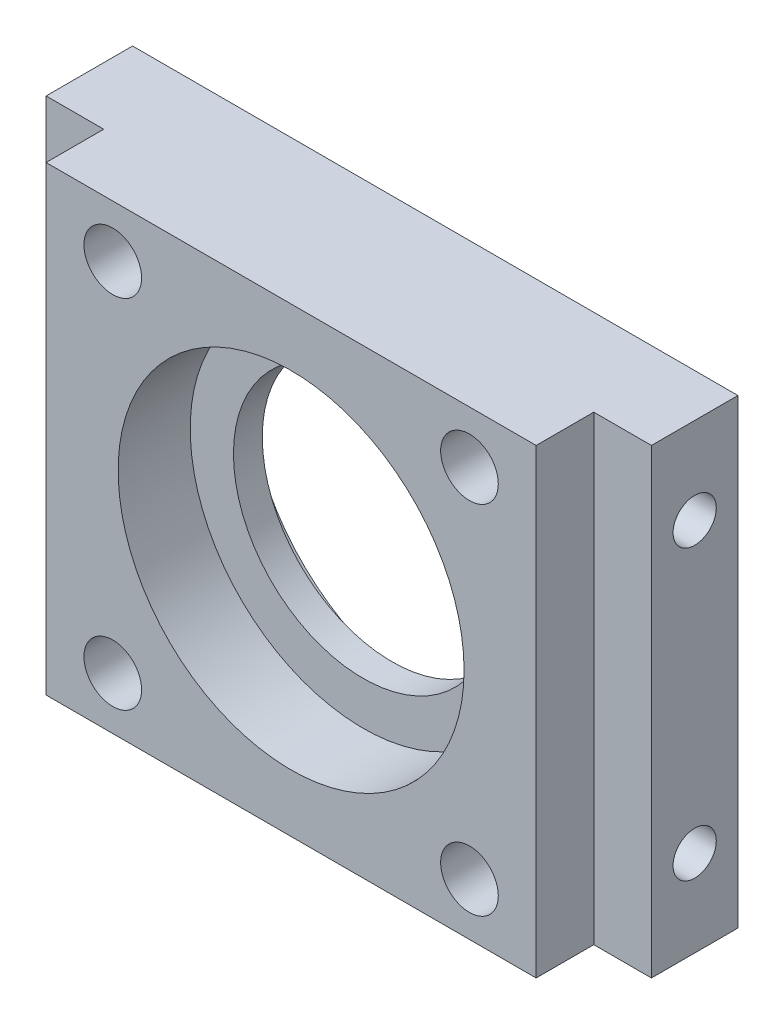
ISO-10303-21;
HEADER;
FILE_DESCRIPTION(('STEP AP214'),'2;1');
FILE_NAME('part.step','',(''),(''),'','','');
FILE_SCHEMA(('AUTOMOTIVE_DESIGN { 1 0 10303 214 1 1 1 1 }'));
ENDSEC;
DATA;
#1=APPLICATION_CONTEXT('core data for automotive mechanical design processes');
#2=APPLICATION_PROTOCOL_DEFINITION('international standard','automotive_design',2000,#1);
#3=PRODUCT_CONTEXT('',#1,'mechanical');
#4=PRODUCT('Part','Part','',(#3));
#5=PRODUCT_RELATED_PRODUCT_CATEGORY('part','',(#4));
#6=PRODUCT_DEFINITION_FORMATION('','',#4);
#7=PRODUCT_DEFINITION_CONTEXT('part definition',#1,'design');
#8=PRODUCT_DEFINITION('design','',#6,#7);
#9=PRODUCT_DEFINITION_SHAPE('','',#8);
#10=(LENGTH_UNIT() NAMED_UNIT(*) SI_UNIT(.MILLI.,.METRE.));
#11=(NAMED_UNIT(*) PLANE_ANGLE_UNIT() SI_UNIT($,.RADIAN.));
#12=(NAMED_UNIT(*) SI_UNIT($,.STERADIAN.) SOLID_ANGLE_UNIT());
#13=UNCERTAINTY_MEASURE_WITH_UNIT(LENGTH_MEASURE(1.E-05),#10,'distance_accuracy_value','');
#14=(GEOMETRIC_REPRESENTATION_CONTEXT(3) GLOBAL_UNCERTAINTY_ASSIGNED_CONTEXT((#13)) GLOBAL_UNIT_ASSIGNED_CONTEXT((#10,
#11,#12)) REPRESENTATION_CONTEXT('',''));
#15=CARTESIAN_POINT('',(0.,0.,0.));
#16=DIRECTION('',(0.,0.,1.));
#17=DIRECTION('',(1.,0.,0.));
#18=AXIS2_PLACEMENT_3D('',#15,#16,#17);
#19=CARTESIAN_POINT('',(0.,0.,38.5269119345812));
#20=DIRECTION('',(0.,0.,-1.));
#21=DIRECTION('',(-1.,0.,0.));
#22=AXIS2_PLACEMENT_3D('',#19,#20,#21);
#23=CYLINDRICAL_SURFACE('',#22,9.);
#24=CARTESIAN_POINT('',(0.,0.,5.));
#25=DIRECTION('',(0.,0.,1.));
#26=DIRECTION('',(1.,0.,0.));
#27=AXIS2_PLACEMENT_3D('',#24,#25,#26);
#28=CIRCLE('',#27,9.);
#29=CARTESIAN_POINT('',(9.,0.,5.));
#30=VERTEX_POINT('',#29);
#31=EDGE_CURVE('E176',#30,#30,#28,.F.);
#32=ORIENTED_EDGE('',*,*,#31,.F.);
#33=EDGE_LOOP('',(#32));
#34=FACE_BOUND('',#33,.T.);
#35=CARTESIAN_POINT('',(0.,0.,3.));
#36=DIRECTION('',(0.,0.,-1.));
#37=DIRECTION('',(-1.,0.,0.));
#38=AXIS2_PLACEMENT_3D('',#35,#36,#37);
#39=CIRCLE('',#38,9.);
#40=CARTESIAN_POINT('',(-9.,0.,3.));
#41=VERTEX_POINT('',#40);
#42=EDGE_CURVE('E46',#41,#41,#39,.F.);
#43=ORIENTED_EDGE('',*,*,#42,.F.);
#44=EDGE_LOOP('',(#43));
#45=FACE_BOUND('',#44,.T.);
#46=ADVANCED_FACE('F42',(#34,#45),#23,.F.);
#47=CARTESIAN_POINT('',(21.,-16.,0.));
#48=DIRECTION('',(1.,0.,0.));
#49=DIRECTION('',(0.,1.,0.));
#50=AXIS2_PLACEMENT_3D('',#47,#48,#49);
#51=PLANE('',#50);
#52=CARTESIAN_POINT('',(21.,-9.99999999999999,3.));
#53=DIRECTION('',(1.,0.,0.));
#54=DIRECTION('',(0.,0.,-1.));
#55=AXIS2_PLACEMENT_3D('',#52,#53,#54);
#56=CIRCLE('',#55,1.49999999999999);
#57=CARTESIAN_POINT('',(21.,-9.99999999999999,1.50000000000001));
#58=VERTEX_POINT('',#57);
#59=EDGE_CURVE('E206',#58,#58,#56,.T.);
#60=ORIENTED_EDGE('',*,*,#59,.F.);
#61=EDGE_LOOP('',(#60));
#62=FACE_BOUND('',#61,.T.);
#63=CARTESIAN_POINT('',(21.,10.,3.));
#64=DIRECTION('',(1.,0.,0.));
#65=DIRECTION('',(0.,0.,-1.));
#66=AXIS2_PLACEMENT_3D('',#63,#64,#65);
#67=CIRCLE('',#66,1.49999999999999);
#68=CARTESIAN_POINT('',(21.,10.,1.50000000000001));
#69=VERTEX_POINT('',#68);
#70=EDGE_CURVE('E212',#69,#69,#67,.T.);
#71=ORIENTED_EDGE('',*,*,#70,.F.);
#72=EDGE_LOOP('',(#71));
#73=FACE_BOUND('',#72,.T.);
#74=DIRECTION('',(0.,-1.,0.));
#75=VECTOR('',#74,1.);
#76=CARTESIAN_POINT('',(21.,16.,6.));
#77=LINE('',#76,#75);
#78=CARTESIAN_POINT('',(21.,16.,6.));
#79=VERTEX_POINT('',#78);
#80=CARTESIAN_POINT('',(21.,-16.,6.));
#81=VERTEX_POINT('',#80);
#82=EDGE_CURVE('E115',#79,#81,#77,.T.);
#83=ORIENTED_EDGE('',*,*,#82,.T.);
#84=DIRECTION('',(0.,0.,1.));
#85=VECTOR('',#84,1.);
#86=CARTESIAN_POINT('',(21.,-16.,0.));
#87=LINE('',#86,#85);
#88=CARTESIAN_POINT('',(21.,-16.,0.));
#89=VERTEX_POINT('',#88);
#90=EDGE_CURVE('E11',#89,#81,#87,.T.);
#91=ORIENTED_EDGE('',*,*,#90,.F.);
#92=DIRECTION('',(0.,1.,0.));
#93=VECTOR('',#92,1.);
#94=CARTESIAN_POINT('',(21.,-16.,0.));
#95=LINE('',#94,#93);
#96=CARTESIAN_POINT('',(21.,16.,0.));
#97=VERTEX_POINT('',#96);
#98=EDGE_CURVE('E154',#89,#97,#95,.T.);
#99=ORIENTED_EDGE('',*,*,#98,.T.);
#100=DIRECTION('',(0.,0.,1.));
#101=VECTOR('',#100,1.);
#102=CARTESIAN_POINT('',(21.,16.,0.));
#103=LINE('',#102,#101);
#104=EDGE_CURVE('E167',#97,#79,#103,.T.);
#105=ORIENTED_EDGE('',*,*,#104,.T.);
#106=EDGE_LOOP('',(#83,#91,#99,#105));
#107=FACE_BOUND('',#106,.T.);
#108=ADVANCED_FACE('F44',(#62,#73,#107),#51,.T.);
#109=CARTESIAN_POINT('',(-21.,-16.,0.));
#110=DIRECTION('',(0.,-1.,0.));
#111=DIRECTION('',(0.,0.,-1.));
#112=AXIS2_PLACEMENT_3D('',#109,#110,#111);
#113=PLANE('',#112);
#114=DIRECTION('',(1.,0.,0.));
#115=VECTOR('',#114,1.);
#116=CARTESIAN_POINT('',(17.,-16.,6.));
#117=LINE('',#116,#115);
#118=CARTESIAN_POINT('',(17.,-16.,6.));
#119=VERTEX_POINT('',#118);
#120=EDGE_CURVE('E129',#119,#81,#117,.T.);
#121=ORIENTED_EDGE('',*,*,#120,.F.);
#122=DIRECTION('',(0.,0.,-1.));
#123=VECTOR('',#122,1.);
#124=CARTESIAN_POINT('',(17.,-16.,10.));
#125=LINE('',#124,#123);
#126=CARTESIAN_POINT('',(17.,-16.,10.));
#127=VERTEX_POINT('',#126);
#128=EDGE_CURVE('E112',#127,#119,#125,.T.);
#129=ORIENTED_EDGE('',*,*,#128,.F.);
#130=DIRECTION('',(1.,0.,0.));
#131=VECTOR('',#130,1.);
#132=CARTESIAN_POINT('',(-21.,-16.,10.));
#133=LINE('',#132,#131);
#134=CARTESIAN_POINT('',(-17.,-16.,10.));
#135=VERTEX_POINT('',#134);
#136=EDGE_CURVE('E158',#135,#127,#133,.T.);
#137=ORIENTED_EDGE('',*,*,#136,.F.);
#138=DIRECTION('',(0.,0.,1.));
#139=VECTOR('',#138,1.);
#140=CARTESIAN_POINT('',(-17.,-16.,6.));
#141=LINE('',#140,#139);
#142=CARTESIAN_POINT('',(-17.,-16.,6.));
#143=VERTEX_POINT('',#142);
#144=EDGE_CURVE('E67',#143,#135,#141,.T.);
#145=ORIENTED_EDGE('',*,*,#144,.F.);
#146=DIRECTION('',(1.,0.,0.));
#147=VECTOR('',#146,1.);
#148=CARTESIAN_POINT('',(-21.,-16.,6.));
#149=LINE('',#148,#147);
#150=CARTESIAN_POINT('',(-21.,-16.,6.));
#151=VERTEX_POINT('',#150);
#152=EDGE_CURVE('E137',#151,#143,#149,.T.);
#153=ORIENTED_EDGE('',*,*,#152,.F.);
#154=DIRECTION('',(0.,0.,1.));
#155=VECTOR('',#154,1.);
#156=CARTESIAN_POINT('',(-21.,-16.,0.));
#157=LINE('',#156,#155);
#158=CARTESIAN_POINT('',(-21.,-16.,0.));
#159=VERTEX_POINT('',#158);
#160=EDGE_CURVE('E51',#159,#151,#157,.T.);
#161=ORIENTED_EDGE('',*,*,#160,.F.);
#162=DIRECTION('',(1.,0.,0.));
#163=VECTOR('',#162,1.);
#164=CARTESIAN_POINT('',(-21.,-16.,0.));
#165=LINE('',#164,#163);
#166=EDGE_CURVE('E164',#159,#89,#165,.T.);
#167=ORIENTED_EDGE('',*,*,#166,.T.);
#168=ORIENTED_EDGE('',*,*,#90,.T.);
#169=EDGE_LOOP('',(#121,#129,#137,#145,#153,#161,#167,#168));
#170=FACE_BOUND('',#169,.T.);
#171=ADVANCED_FACE('F264',(#170),#113,.T.);
#172=CARTESIAN_POINT('',(-21.,16.,0.));
#173=DIRECTION('',(-1.,0.,0.));
#174=DIRECTION('',(0.,-1.,0.));
#175=AXIS2_PLACEMENT_3D('',#172,#173,#174);
#176=PLANE('',#175);
#177=CARTESIAN_POINT('',(-21.,-9.99999999999999,3.));
#178=DIRECTION('',(-1.,0.,0.));
#179=DIRECTION('',(0.,0.,1.));
#180=AXIS2_PLACEMENT_3D('',#177,#178,#179);
#181=CIRCLE('',#180,1.49999999999999);
#182=CARTESIAN_POINT('',(-21.,-9.99999999999999,4.49999999999999));
#183=VERTEX_POINT('',#182);
#184=EDGE_CURVE('E183',#183,#183,#181,.T.);
#185=ORIENTED_EDGE('',*,*,#184,.F.);
#186=EDGE_LOOP('',(#185));
#187=FACE_BOUND('',#186,.T.);
#188=CARTESIAN_POINT('',(-21.,10.,3.));
#189=DIRECTION('',(-1.,0.,0.));
#190=DIRECTION('',(0.,0.,1.));
#191=AXIS2_PLACEMENT_3D('',#188,#189,#190);
#192=CIRCLE('',#191,1.49999999999999);
#193=CARTESIAN_POINT('',(-21.,10.,4.49999999999999));
#194=VERTEX_POINT('',#193);
#195=EDGE_CURVE('E200',#194,#194,#192,.T.);
#196=ORIENTED_EDGE('',*,*,#195,.F.);
#197=EDGE_LOOP('',(#196));
#198=FACE_BOUND('',#197,.T.);
#199=DIRECTION('',(0.,-1.,0.));
#200=VECTOR('',#199,1.);
#201=CARTESIAN_POINT('',(-21.,16.,6.));
#202=LINE('',#201,#200);
#203=CARTESIAN_POINT('',(-21.,16.,6.));
#204=VERTEX_POINT('',#203);
#205=EDGE_CURVE('E145',#204,#151,#202,.T.);
#206=ORIENTED_EDGE('',*,*,#205,.F.);
#207=DIRECTION('',(0.,0.,1.));
#208=VECTOR('',#207,1.);
#209=CARTESIAN_POINT('',(-21.,16.,0.));
#210=LINE('',#209,#208);
#211=CARTESIAN_POINT('',(-21.,16.,0.));
#212=VERTEX_POINT('',#211);
#213=EDGE_CURVE('E173',#212,#204,#210,.T.);
#214=ORIENTED_EDGE('',*,*,#213,.F.);
#215=DIRECTION('',(0.,-1.,0.));
#216=VECTOR('',#215,1.);
#217=CARTESIAN_POINT('',(-21.,16.,0.));
#218=LINE('',#217,#216);
#219=EDGE_CURVE('E161',#212,#159,#218,.T.);
#220=ORIENTED_EDGE('',*,*,#219,.T.);
#221=ORIENTED_EDGE('',*,*,#160,.T.);
#222=EDGE_LOOP('',(#206,#214,#220,#221));
#223=FACE_BOUND('',#222,.T.);
#224=ADVANCED_FACE('F337',(#187,#198,#223),#176,.T.);
#225=CARTESIAN_POINT('',(21.,16.,0.));
#226=DIRECTION('',(0.,1.,0.));
#227=DIRECTION('',(0.,0.,1.));
#228=AXIS2_PLACEMENT_3D('',#225,#226,#227);
#229=PLANE('',#228);
#230=DIRECTION('',(1.,0.,0.));
#231=VECTOR('',#230,1.);
#232=CARTESIAN_POINT('',(17.,16.,6.));
#233=LINE('',#232,#231);
#234=CARTESIAN_POINT('',(17.,16.,6.));
#235=VERTEX_POINT('',#234);
#236=EDGE_CURVE('E119',#235,#79,#233,.T.);
#237=ORIENTED_EDGE('',*,*,#236,.T.);
#238=ORIENTED_EDGE('',*,*,#104,.F.);
#239=DIRECTION('',(-1.,0.,0.));
#240=VECTOR('',#239,1.);
#241=CARTESIAN_POINT('',(21.,16.,0.));
#242=LINE('',#241,#240);
#243=EDGE_CURVE('E157',#97,#212,#242,.T.);
#244=ORIENTED_EDGE('',*,*,#243,.T.);
#245=ORIENTED_EDGE('',*,*,#213,.T.);
#246=DIRECTION('',(1.,0.,0.));
#247=VECTOR('',#246,1.);
#248=CARTESIAN_POINT('',(-21.,16.,6.));
#249=LINE('',#248,#247);
#250=CARTESIAN_POINT('',(-17.,16.,6.));
#251=VERTEX_POINT('',#250);
#252=EDGE_CURVE('E140',#204,#251,#249,.T.);
#253=ORIENTED_EDGE('',*,*,#252,.T.);
#254=DIRECTION('',(0.,0.,1.));
#255=VECTOR('',#254,1.);
#256=CARTESIAN_POINT('',(-17.,16.,6.));
#257=LINE('',#256,#255);
#258=CARTESIAN_POINT('',(-17.,16.,10.));
#259=VERTEX_POINT('',#258);
#260=EDGE_CURVE('E143',#251,#259,#257,.T.);
#261=ORIENTED_EDGE('',*,*,#260,.T.);
#262=DIRECTION('',(-1.,0.,0.));
#263=VECTOR('',#262,1.);
#264=CARTESIAN_POINT('',(21.,16.,10.));
#265=LINE('',#264,#263);
#266=CARTESIAN_POINT('',(17.,16.,10.));
#267=VERTEX_POINT('',#266);
#268=EDGE_CURVE('E128',#267,#259,#265,.T.);
#269=ORIENTED_EDGE('',*,*,#268,.F.);
#270=DIRECTION('',(0.,0.,-1.));
#271=VECTOR('',#270,1.);
#272=CARTESIAN_POINT('',(17.,16.,10.));
#273=LINE('',#272,#271);
#274=EDGE_CURVE('E59',#267,#235,#273,.T.);
#275=ORIENTED_EDGE('',*,*,#274,.T.);
#276=EDGE_LOOP('',(#237,#238,#244,#245,#253,#261,#269,#275));
#277=FACE_BOUND('',#276,.T.);
#278=ADVANCED_FACE('F126',(#277),#229,.T.);
#279=CARTESIAN_POINT('',(0.,0.,0.));
#280=DIRECTION('',(0.,0.,1.));
#281=DIRECTION('',(1.,0.,0.));
#282=AXIS2_PLACEMENT_3D('',#279,#280,#281);
#283=PLANE('',#282);
#284=CARTESIAN_POINT('',(0.,0.,0.));
#285=DIRECTION('',(0.,0.,-1.));
#286=DIRECTION('',(-1.,0.,0.));
#287=AXIS2_PLACEMENT_3D('',#284,#285,#286);
#288=CIRCLE('',#287,13.);
#289=CARTESIAN_POINT('',(-13.,0.,0.));
#290=VERTEX_POINT('',#289);
#291=EDGE_CURVE('E192',#290,#290,#288,.T.);
#292=ORIENTED_EDGE('',*,*,#291,.F.);
#293=EDGE_LOOP('',(#292));
#294=FACE_BOUND('',#293,.T.);
#295=CARTESIAN_POINT('',(12.3743686707646,12.3743686707646,0.));
#296=DIRECTION('',(0.,0.,1.));
#297=DIRECTION('',(1.,0.,0.));
#298=AXIS2_PLACEMENT_3D('',#295,#296,#297);
#299=CIRCLE('',#298,1.99999999999999);
#300=CARTESIAN_POINT('',(14.3743686707646,12.3743686707646,0.));
#301=VERTEX_POINT('',#300);
#302=EDGE_CURVE('E221',#301,#301,#299,.T.);
#303=ORIENTED_EDGE('',*,*,#302,.T.);
#304=EDGE_LOOP('',(#303));
#305=FACE_BOUND('',#304,.T.);
#306=CARTESIAN_POINT('',(12.3743686707646,-12.3743686707646,0.));
#307=DIRECTION('',(0.,0.,1.));
#308=DIRECTION('',(1.,0.,0.));
#309=AXIS2_PLACEMENT_3D('',#306,#307,#308);
#310=CIRCLE('',#309,1.99999999999999);
#311=CARTESIAN_POINT('',(14.3743686707646,-12.3743686707646,0.));
#312=VERTEX_POINT('',#311);
#313=EDGE_CURVE('E227',#312,#312,#310,.T.);
#314=ORIENTED_EDGE('',*,*,#313,.T.);
#315=EDGE_LOOP('',(#314));
#316=FACE_BOUND('',#315,.T.);
#317=CARTESIAN_POINT('',(-12.3743686707646,-12.3743686707646,0.));
#318=DIRECTION('',(0.,0.,1.));
#319=DIRECTION('',(1.,0.,0.));
#320=AXIS2_PLACEMENT_3D('',#317,#318,#319);
#321=CIRCLE('',#320,1.99999999999999);
#322=CARTESIAN_POINT('',(-10.3743686707646,-12.3743686707646,0.));
#323=VERTEX_POINT('',#322);
#324=EDGE_CURVE('E233',#323,#323,#321,.T.);
#325=ORIENTED_EDGE('',*,*,#324,.T.);
#326=EDGE_LOOP('',(#325));
#327=FACE_BOUND('',#326,.T.);
#328=CARTESIAN_POINT('',(-12.3743686707646,12.3743686707646,0.));
#329=DIRECTION('',(0.,0.,1.));
#330=DIRECTION('',(1.,0.,0.));
#331=AXIS2_PLACEMENT_3D('',#328,#329,#330);
#332=CIRCLE('',#331,1.99999999999999);
#333=CARTESIAN_POINT('',(-10.3743686707646,12.3743686707646,0.));
#334=VERTEX_POINT('',#333);
#335=EDGE_CURVE('E133',#334,#334,#332,.T.);
#336=ORIENTED_EDGE('',*,*,#335,.T.);
#337=EDGE_LOOP('',(#336));
#338=FACE_BOUND('',#337,.T.);
#339=ORIENTED_EDGE('',*,*,#98,.F.);
#340=ORIENTED_EDGE('',*,*,#166,.F.);
#341=ORIENTED_EDGE('',*,*,#219,.F.);
#342=ORIENTED_EDGE('',*,*,#243,.F.);
#343=EDGE_LOOP('',(#339,#340,#341,#342));
#344=FACE_BOUND('',#343,.T.);
#345=ADVANCED_FACE('F242',(#294,#305,#316,#327,#338,#344),#283,.F.);
#346=CARTESIAN_POINT('',(0.,0.,10.));
#347=DIRECTION('',(0.,0.,1.));
#348=DIRECTION('',(1.,0.,0.));
#349=AXIS2_PLACEMENT_3D('',#346,#347,#348);
#350=PLANE('',#349);
#351=CARTESIAN_POINT('',(0.,0.,10.));
#352=DIRECTION('',(0.,0.,1.));
#353=DIRECTION('',(1.,0.,0.));
#354=AXIS2_PLACEMENT_3D('',#351,#352,#353);
#355=CIRCLE('',#354,12.);
#356=CARTESIAN_POINT('',(12.,0.,10.));
#357=VERTEX_POINT('',#356);
#358=EDGE_CURVE('E178',#357,#357,#355,.T.);
#359=ORIENTED_EDGE('',*,*,#358,.F.);
#360=EDGE_LOOP('',(#359));
#361=FACE_BOUND('',#360,.T.);
#362=CARTESIAN_POINT('',(12.3743686707646,12.3743686707646,10.));
#363=DIRECTION('',(0.,0.,1.));
#364=DIRECTION('',(1.,0.,0.));
#365=AXIS2_PLACEMENT_3D('',#362,#363,#364);
#366=CIRCLE('',#365,1.99999999999999);
#367=CARTESIAN_POINT('',(14.3743686707646,12.3743686707646,10.));
#368=VERTEX_POINT('',#367);
#369=EDGE_CURVE('E218',#368,#368,#366,.T.);
#370=ORIENTED_EDGE('',*,*,#369,.F.);
#371=EDGE_LOOP('',(#370));
#372=FACE_BOUND('',#371,.T.);
#373=CARTESIAN_POINT('',(12.3743686707646,-12.3743686707646,10.));
#374=DIRECTION('',(0.,0.,1.));
#375=DIRECTION('',(1.,0.,0.));
#376=AXIS2_PLACEMENT_3D('',#373,#374,#375);
#377=CIRCLE('',#376,1.99999999999999);
#378=CARTESIAN_POINT('',(14.3743686707646,-12.3743686707646,10.));
#379=VERTEX_POINT('',#378);
#380=EDGE_CURVE('E224',#379,#379,#377,.T.);
#381=ORIENTED_EDGE('',*,*,#380,.F.);
#382=EDGE_LOOP('',(#381));
#383=FACE_BOUND('',#382,.T.);
#384=CARTESIAN_POINT('',(-12.3743686707646,-12.3743686707646,10.));
#385=DIRECTION('',(0.,0.,1.));
#386=DIRECTION('',(1.,0.,0.));
#387=AXIS2_PLACEMENT_3D('',#384,#385,#386);
#388=CIRCLE('',#387,1.99999999999999);
#389=CARTESIAN_POINT('',(-10.3743686707646,-12.3743686707646,10.));
#390=VERTEX_POINT('',#389);
#391=EDGE_CURVE('E230',#390,#390,#388,.T.);
#392=ORIENTED_EDGE('',*,*,#391,.F.);
#393=EDGE_LOOP('',(#392));
#394=FACE_BOUND('',#393,.T.);
#395=CARTESIAN_POINT('',(-12.3743686707646,12.3743686707646,10.));
#396=DIRECTION('',(0.,0.,1.));
#397=DIRECTION('',(1.,0.,0.));
#398=AXIS2_PLACEMENT_3D('',#395,#396,#397);
#399=CIRCLE('',#398,1.99999999999999);
#400=CARTESIAN_POINT('',(-10.3743686707646,12.3743686707646,10.));
#401=VERTEX_POINT('',#400);
#402=EDGE_CURVE('E235',#401,#401,#399,.T.);
#403=ORIENTED_EDGE('',*,*,#402,.F.);
#404=EDGE_LOOP('',(#403));
#405=FACE_BOUND('',#404,.T.);
#406=DIRECTION('',(0.,-1.,0.));
#407=VECTOR('',#406,1.);
#408=CARTESIAN_POINT('',(17.,16.,10.));
#409=LINE('',#408,#407);
#410=EDGE_CURVE('E116',#267,#127,#409,.T.);
#411=ORIENTED_EDGE('',*,*,#410,.F.);
#412=ORIENTED_EDGE('',*,*,#268,.T.);
#413=DIRECTION('',(0.,-1.,0.));
#414=VECTOR('',#413,1.);
#415=CARTESIAN_POINT('',(-17.,16.,10.));
#416=LINE('',#415,#414);
#417=EDGE_CURVE('E149',#259,#135,#416,.T.);
#418=ORIENTED_EDGE('',*,*,#417,.T.);
#419=ORIENTED_EDGE('',*,*,#136,.T.);
#420=EDGE_LOOP('',(#411,#412,#418,#419));
#421=FACE_BOUND('',#420,.T.);
#422=ADVANCED_FACE('F319',(#361,#372,#383,#394,#405,#421),#350,.T.);
#423=CARTESIAN_POINT('',(-17.,16.,6.));
#424=DIRECTION('',(1.,0.,0.));
#425=DIRECTION('',(0.,0.,-1.));
#426=AXIS2_PLACEMENT_3D('',#423,#424,#425);
#427=PLANE('',#426);
#428=ORIENTED_EDGE('',*,*,#144,.T.);
#429=ORIENTED_EDGE('',*,*,#417,.F.);
#430=ORIENTED_EDGE('',*,*,#260,.F.);
#431=DIRECTION('',(0.,-1.,0.));
#432=VECTOR('',#431,1.);
#433=CARTESIAN_POINT('',(-17.,16.,6.));
#434=LINE('',#433,#432);
#435=EDGE_CURVE('E151',#251,#143,#434,.T.);
#436=ORIENTED_EDGE('',*,*,#435,.T.);
#437=EDGE_LOOP('',(#428,#429,#430,#436));
#438=FACE_BOUND('',#437,.T.);
#439=ADVANCED_FACE('F322',(#438),#427,.F.);
#440=CARTESIAN_POINT('',(-21.,16.,6.));
#441=DIRECTION('',(0.,0.,-1.));
#442=DIRECTION('',(-1.,0.,0.));
#443=AXIS2_PLACEMENT_3D('',#440,#441,#442);
#444=PLANE('',#443);
#445=ORIENTED_EDGE('',*,*,#152,.T.);
#446=ORIENTED_EDGE('',*,*,#435,.F.);
#447=ORIENTED_EDGE('',*,*,#252,.F.);
#448=ORIENTED_EDGE('',*,*,#205,.T.);
#449=EDGE_LOOP('',(#445,#446,#447,#448));
#450=FACE_BOUND('',#449,.T.);
#451=ADVANCED_FACE('F340',(#450),#444,.F.);
#452=CARTESIAN_POINT('',(17.,16.,6.));
#453=DIRECTION('',(0.,0.,-1.));
#454=DIRECTION('',(-1.,0.,0.));
#455=AXIS2_PLACEMENT_3D('',#452,#453,#454);
#456=PLANE('',#455);
#457=ORIENTED_EDGE('',*,*,#120,.T.);
#458=ORIENTED_EDGE('',*,*,#82,.F.);
#459=ORIENTED_EDGE('',*,*,#236,.F.);
#460=DIRECTION('',(0.,-1.,0.));
#461=VECTOR('',#460,1.);
#462=CARTESIAN_POINT('',(17.,16.,6.));
#463=LINE('',#462,#461);
#464=EDGE_CURVE('E108',#235,#119,#463,.T.);
#465=ORIENTED_EDGE('',*,*,#464,.T.);
#466=EDGE_LOOP('',(#457,#458,#459,#465));
#467=FACE_BOUND('',#466,.T.);
#468=ADVANCED_FACE('F120',(#467),#456,.F.);
#469=CARTESIAN_POINT('',(17.,16.,10.));
#470=DIRECTION('',(-1.,0.,0.));
#471=DIRECTION('',(0.,0.,1.));
#472=AXIS2_PLACEMENT_3D('',#469,#470,#471);
#473=PLANE('',#472);
#474=ORIENTED_EDGE('',*,*,#128,.T.);
#475=ORIENTED_EDGE('',*,*,#464,.F.);
#476=ORIENTED_EDGE('',*,*,#274,.F.);
#477=ORIENTED_EDGE('',*,*,#410,.T.);
#478=EDGE_LOOP('',(#474,#475,#476,#477));
#479=FACE_BOUND('',#478,.T.);
#480=ADVANCED_FACE('F110',(#479),#473,.F.);
#481=CARTESIAN_POINT('',(-12.3743686707646,12.3743686707646,10.));
#482=DIRECTION('',(0.,0.,1.));
#483=DIRECTION('',(1.,0.,0.));
#484=AXIS2_PLACEMENT_3D('',#481,#482,#483);
#485=CYLINDRICAL_SURFACE('',#484,1.99999999999999);
#486=ORIENTED_EDGE('',*,*,#335,.F.);
#487=EDGE_LOOP('',(#486));
#488=FACE_BOUND('',#487,.T.);
#489=ORIENTED_EDGE('',*,*,#402,.T.);
#490=EDGE_LOOP('',(#489));
#491=FACE_BOUND('',#490,.T.);
#492=ADVANCED_FACE('F245',(#488,#491),#485,.F.);
#493=CARTESIAN_POINT('',(-12.3743686707646,-12.3743686707646,10.));
#494=DIRECTION('',(0.,0.,1.));
#495=DIRECTION('',(1.,0.,0.));
#496=AXIS2_PLACEMENT_3D('',#493,#494,#495);
#497=CYLINDRICAL_SURFACE('',#496,1.99999999999999);
#498=ORIENTED_EDGE('',*,*,#324,.F.);
#499=EDGE_LOOP('',(#498));
#500=FACE_BOUND('',#499,.T.);
#501=ORIENTED_EDGE('',*,*,#391,.T.);
#502=EDGE_LOOP('',(#501));
#503=FACE_BOUND('',#502,.T.);
#504=ADVANCED_FACE('F247',(#500,#503),#497,.F.);
#505=CARTESIAN_POINT('',(12.3743686707646,-12.3743686707646,10.));
#506=DIRECTION('',(0.,0.,1.));
#507=DIRECTION('',(1.,0.,0.));
#508=AXIS2_PLACEMENT_3D('',#505,#506,#507);
#509=CYLINDRICAL_SURFACE('',#508,1.99999999999999);
#510=ORIENTED_EDGE('',*,*,#313,.F.);
#511=EDGE_LOOP('',(#510));
#512=FACE_BOUND('',#511,.T.);
#513=ORIENTED_EDGE('',*,*,#380,.T.);
#514=EDGE_LOOP('',(#513));
#515=FACE_BOUND('',#514,.T.);
#516=ADVANCED_FACE('F253',(#512,#515),#509,.F.);
#517=CARTESIAN_POINT('',(12.3743686707646,12.3743686707646,10.));
#518=DIRECTION('',(0.,0.,1.));
#519=DIRECTION('',(1.,0.,0.));
#520=AXIS2_PLACEMENT_3D('',#517,#518,#519);
#521=CYLINDRICAL_SURFACE('',#520,1.99999999999999);
#522=ORIENTED_EDGE('',*,*,#302,.F.);
#523=EDGE_LOOP('',(#522));
#524=FACE_BOUND('',#523,.T.);
#525=ORIENTED_EDGE('',*,*,#369,.T.);
#526=EDGE_LOOP('',(#525));
#527=FACE_BOUND('',#526,.T.);
#528=ADVANCED_FACE('F306',(#524,#527),#521,.F.);
#529=CARTESIAN_POINT('',(15.,10.,3.));
#530=DIRECTION('',(-1.,0.,0.));
#531=DIRECTION('',(0.,0.,1.));
#532=AXIS2_PLACEMENT_3D('',#529,#530,#531);
#533=PLANE('',#532);
#534=CARTESIAN_POINT('',(15.,10.,3.));
#535=DIRECTION('',(1.,0.,0.));
#536=DIRECTION('',(0.,0.,-1.));
#537=AXIS2_PLACEMENT_3D('',#534,#535,#536);
#538=CIRCLE('',#537,1.49999999999999);
#539=CARTESIAN_POINT('',(15.,10.,1.50000000000002));
#540=VERTEX_POINT('',#539);
#541=EDGE_CURVE('E215',#540,#540,#538,.T.);
#542=ORIENTED_EDGE('',*,*,#541,.T.);
#543=EDGE_LOOP('',(#542));
#544=FACE_BOUND('',#543,.T.);
#545=ADVANCED_FACE('F302',(#544),#533,.F.);
#546=CARTESIAN_POINT('',(21.,10.,3.));
#547=DIRECTION('',(1.,0.,0.));
#548=DIRECTION('',(0.,0.,-1.));
#549=AXIS2_PLACEMENT_3D('',#546,#547,#548);
#550=CYLINDRICAL_SURFACE('',#549,1.49999999999999);
#551=ORIENTED_EDGE('',*,*,#541,.F.);
#552=EDGE_LOOP('',(#551));
#553=FACE_BOUND('',#552,.T.);
#554=ORIENTED_EDGE('',*,*,#70,.T.);
#555=EDGE_LOOP('',(#554));
#556=FACE_BOUND('',#555,.T.);
#557=ADVANCED_FACE('F298',(#553,#556),#550,.F.);
#558=CARTESIAN_POINT('',(15.,-9.99999999999999,3.));
#559=DIRECTION('',(-1.,0.,0.));
#560=DIRECTION('',(0.,0.,1.));
#561=AXIS2_PLACEMENT_3D('',#558,#559,#560);
#562=PLANE('',#561);
#563=CARTESIAN_POINT('',(15.,-9.99999999999999,3.));
#564=DIRECTION('',(1.,0.,0.));
#565=DIRECTION('',(0.,0.,-1.));
#566=AXIS2_PLACEMENT_3D('',#563,#564,#565);
#567=CIRCLE('',#566,1.49999999999999);
#568=CARTESIAN_POINT('',(15.,-9.99999999999999,1.50000000000002));
#569=VERTEX_POINT('',#568);
#570=EDGE_CURVE('E209',#569,#569,#567,.T.);
#571=ORIENTED_EDGE('',*,*,#570,.T.);
#572=EDGE_LOOP('',(#571));
#573=FACE_BOUND('',#572,.T.);
#574=ADVANCED_FACE('F294',(#573),#562,.F.);
#575=CARTESIAN_POINT('',(21.,-9.99999999999999,3.));
#576=DIRECTION('',(1.,0.,0.));
#577=DIRECTION('',(0.,0.,-1.));
#578=AXIS2_PLACEMENT_3D('',#575,#576,#577);
#579=CYLINDRICAL_SURFACE('',#578,1.49999999999999);
#580=ORIENTED_EDGE('',*,*,#570,.F.);
#581=EDGE_LOOP('',(#580));
#582=FACE_BOUND('',#581,.T.);
#583=ORIENTED_EDGE('',*,*,#59,.T.);
#584=EDGE_LOOP('',(#583));
#585=FACE_BOUND('',#584,.T.);
#586=ADVANCED_FACE('F290',(#582,#585),#579,.F.);
#587=CARTESIAN_POINT('',(-15.,10.,3.));
#588=DIRECTION('',(1.,0.,0.));
#589=DIRECTION('',(0.,0.,-1.));
#590=AXIS2_PLACEMENT_3D('',#587,#588,#589);
#591=PLANE('',#590);
#592=CARTESIAN_POINT('',(-15.,10.,3.));
#593=DIRECTION('',(-1.,0.,0.));
#594=DIRECTION('',(0.,0.,1.));
#595=AXIS2_PLACEMENT_3D('',#592,#593,#594);
#596=CIRCLE('',#595,1.49999999999999);
#597=CARTESIAN_POINT('',(-15.,10.,4.49999999999999));
#598=VERTEX_POINT('',#597);
#599=EDGE_CURVE('E203',#598,#598,#596,.T.);
#600=ORIENTED_EDGE('',*,*,#599,.T.);
#601=EDGE_LOOP('',(#600));
#602=FACE_BOUND('',#601,.T.);
#603=ADVANCED_FACE('F286',(#602),#591,.F.);
#604=CARTESIAN_POINT('',(-21.,10.,3.));
#605=DIRECTION('',(-1.,0.,0.));
#606=DIRECTION('',(0.,0.,1.));
#607=AXIS2_PLACEMENT_3D('',#604,#605,#606);
#608=CYLINDRICAL_SURFACE('',#607,1.49999999999999);
#609=ORIENTED_EDGE('',*,*,#599,.F.);
#610=EDGE_LOOP('',(#609));
#611=FACE_BOUND('',#610,.T.);
#612=ORIENTED_EDGE('',*,*,#195,.T.);
#613=EDGE_LOOP('',(#612));
#614=FACE_BOUND('',#613,.T.);
#615=ADVANCED_FACE('F282',(#611,#614),#608,.F.);
#616=CARTESIAN_POINT('',(-15.,-9.99999999999999,3.));
#617=DIRECTION('',(1.,0.,0.));
#618=DIRECTION('',(0.,0.,-1.));
#619=AXIS2_PLACEMENT_3D('',#616,#617,#618);
#620=PLANE('',#619);
#621=CARTESIAN_POINT('',(-15.,-9.99999999999999,3.));
#622=DIRECTION('',(-1.,0.,0.));
#623=DIRECTION('',(0.,0.,1.));
#624=AXIS2_PLACEMENT_3D('',#621,#622,#623);
#625=CIRCLE('',#624,1.49999999999999);
#626=CARTESIAN_POINT('',(-15.,-9.99999999999999,4.49999999999999));
#627=VERTEX_POINT('',#626);
#628=EDGE_CURVE('E197',#627,#627,#625,.T.);
#629=ORIENTED_EDGE('',*,*,#628,.T.);
#630=EDGE_LOOP('',(#629));
#631=FACE_BOUND('',#630,.T.);
#632=ADVANCED_FACE('F278',(#631),#620,.F.);
#633=CARTESIAN_POINT('',(-21.,-9.99999999999999,3.));
#634=DIRECTION('',(-1.,0.,0.));
#635=DIRECTION('',(0.,0.,1.));
#636=AXIS2_PLACEMENT_3D('',#633,#634,#635);
#637=CYLINDRICAL_SURFACE('',#636,1.49999999999999);
#638=ORIENTED_EDGE('',*,*,#628,.F.);
#639=EDGE_LOOP('',(#638));
#640=FACE_BOUND('',#639,.T.);
#641=ORIENTED_EDGE('',*,*,#184,.T.);
#642=EDGE_LOOP('',(#641));
#643=FACE_BOUND('',#642,.T.);
#644=ADVANCED_FACE('F274',(#640,#643),#637,.F.);
#645=CARTESIAN_POINT('',(0.,0.,10.));
#646=DIRECTION('',(0.,0.,1.));
#647=DIRECTION('',(1.,0.,0.));
#648=AXIS2_PLACEMENT_3D('',#645,#646,#647);
#649=CYLINDRICAL_SURFACE('',#648,12.);
#650=ORIENTED_EDGE('',*,*,#358,.T.);
#651=EDGE_LOOP('',(#650));
#652=FACE_BOUND('',#651,.T.);
#653=CARTESIAN_POINT('',(0.,0.,5.));
#654=DIRECTION('',(0.,0.,1.));
#655=DIRECTION('',(1.,0.,0.));
#656=AXIS2_PLACEMENT_3D('',#653,#654,#655);
#657=CIRCLE('',#656,12.);
#658=CARTESIAN_POINT('',(12.,0.,5.));
#659=VERTEX_POINT('',#658);
#660=EDGE_CURVE('E179',#659,#659,#657,.T.);
#661=ORIENTED_EDGE('',*,*,#660,.F.);
#662=EDGE_LOOP('',(#661));
#663=FACE_BOUND('',#662,.T.);
#664=ADVANCED_FACE('F271',(#652,#663),#649,.F.);
#665=CARTESIAN_POINT('',(0.,0.,5.));
#666=DIRECTION('',(0.,0.,1.));
#667=DIRECTION('',(1.,0.,0.));
#668=AXIS2_PLACEMENT_3D('',#665,#666,#667);
#669=PLANE('',#668);
#670=ORIENTED_EDGE('',*,*,#660,.T.);
#671=EDGE_LOOP('',(#670));
#672=FACE_BOUND('',#671,.T.);
#673=ORIENTED_EDGE('',*,*,#31,.T.);
#674=EDGE_LOOP('',(#673));
#675=FACE_BOUND('',#674,.T.);
#676=ADVANCED_FACE('F269',(#672,#675),#669,.T.);
#677=CARTESIAN_POINT('',(0.,0.,3.));
#678=DIRECTION('',(0.,0.,-1.));
#679=DIRECTION('',(-1.,0.,0.));
#680=AXIS2_PLACEMENT_3D('',#677,#678,#679);
#681=PLANE('',#680);
#682=CARTESIAN_POINT('',(0.,0.,3.));
#683=DIRECTION('',(0.,0.,-1.));
#684=DIRECTION('',(-1.,0.,0.));
#685=AXIS2_PLACEMENT_3D('',#682,#683,#684);
#686=CIRCLE('',#685,13.);
#687=CARTESIAN_POINT('',(-13.,0.,3.));
#688=VERTEX_POINT('',#687);
#689=EDGE_CURVE('E190',#688,#688,#686,.T.);
#690=ORIENTED_EDGE('',*,*,#689,.T.);
#691=EDGE_LOOP('',(#690));
#692=FACE_BOUND('',#691,.T.);
#693=ORIENTED_EDGE('',*,*,#42,.T.);
#694=EDGE_LOOP('',(#693));
#695=FACE_BOUND('',#694,.T.);
#696=ADVANCED_FACE('F393',(#692,#695),#681,.T.);
#697=CARTESIAN_POINT('',(0.,0.,3.));
#698=DIRECTION('',(0.,0.,-1.));
#699=DIRECTION('',(-1.,0.,0.));
#700=AXIS2_PLACEMENT_3D('',#697,#698,#699);
#701=CYLINDRICAL_SURFACE('',#700,13.);
#702=ORIENTED_EDGE('',*,*,#689,.F.);
#703=EDGE_LOOP('',(#702));
#704=FACE_BOUND('',#703,.T.);
#705=ORIENTED_EDGE('',*,*,#291,.T.);
#706=EDGE_LOOP('',(#705));
#707=FACE_BOUND('',#706,.T.);
#708=ADVANCED_FACE('F406',(#704,#707),#701,.F.);
#709=CLOSED_SHELL('',(#46,#108,#171,#224,#278,#345,#422,#439,#451,#468,#480,#492,#504,#516,#528,
#545,#557,#574,#586,#603,#615,#632,#644,#664,#676,#696,#708));
#710=MANIFOLD_SOLID_BREP('B2',#709);
#711=ADVANCED_BREP_SHAPE_REPRESENTATION('',(#18,#710),#14);
#712=SHAPE_DEFINITION_REPRESENTATION(#9,#711);
ENDSEC;
END-ISO-10303-21;
